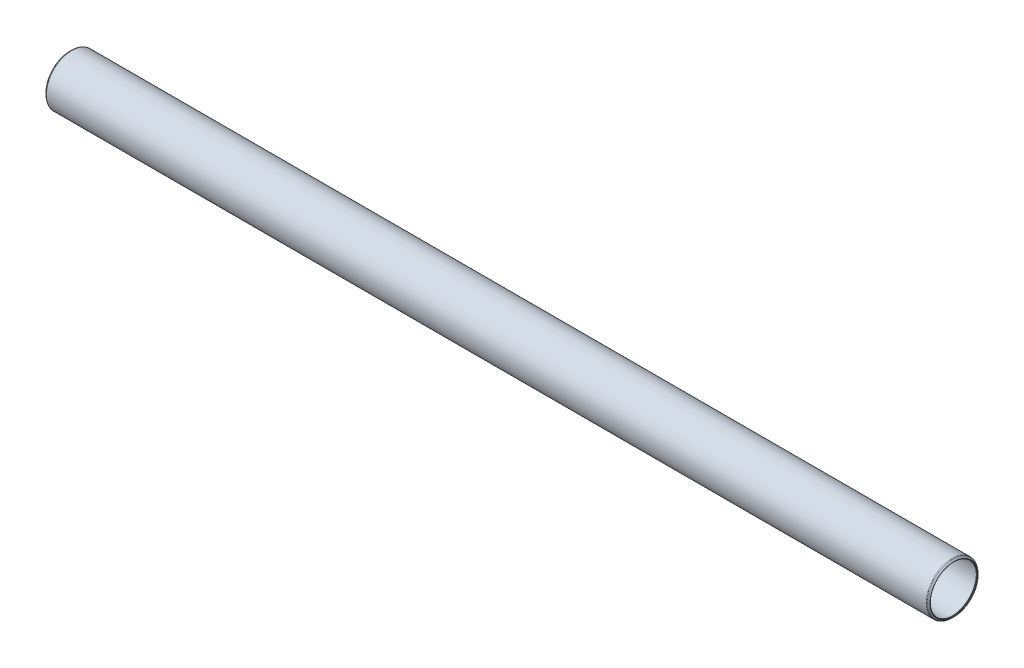
ISO-10303-21;
HEADER;
FILE_DESCRIPTION(('STEP AP214'),'2;1');
FILE_NAME('part.step','',(''),(''),'','','');
FILE_SCHEMA(('AUTOMOTIVE_DESIGN { 1 0 10303 214 1 1 1 1 }'));
ENDSEC;
DATA;
#1=APPLICATION_CONTEXT('core data for automotive mechanical design processes');
#2=APPLICATION_PROTOCOL_DEFINITION('international standard','automotive_design',2000,#1);
#3=PRODUCT_CONTEXT('',#1,'mechanical');
#4=PRODUCT('Part','Part','',(#3));
#5=PRODUCT_RELATED_PRODUCT_CATEGORY('part','',(#4));
#6=PRODUCT_DEFINITION_FORMATION('','',#4);
#7=PRODUCT_DEFINITION_CONTEXT('part definition',#1,'design');
#8=PRODUCT_DEFINITION('design','',#6,#7);
#9=PRODUCT_DEFINITION_SHAPE('','',#8);
#10=(LENGTH_UNIT() NAMED_UNIT(*) SI_UNIT(.MILLI.,.METRE.));
#11=(NAMED_UNIT(*) PLANE_ANGLE_UNIT() SI_UNIT($,.RADIAN.));
#12=(NAMED_UNIT(*) SI_UNIT($,.STERADIAN.) SOLID_ANGLE_UNIT());
#13=UNCERTAINTY_MEASURE_WITH_UNIT(LENGTH_MEASURE(1.E-05),#10,'distance_accuracy_value','');
#14=(GEOMETRIC_REPRESENTATION_CONTEXT(3) GLOBAL_UNCERTAINTY_ASSIGNED_CONTEXT((#13)) GLOBAL_UNIT_ASSIGNED_CONTEXT((#10,
#11,#12)) REPRESENTATION_CONTEXT('',''));
#15=CARTESIAN_POINT('',(0.,0.,0.));
#16=DIRECTION('',(0.,0.,1.));
#17=DIRECTION('',(1.,0.,0.));
#18=AXIS2_PLACEMENT_3D('',#15,#16,#17);
#19=CARTESIAN_POINT('',(403.01545,0.,0.));
#20=DIRECTION('',(-1.,0.,0.));
#21=DIRECTION('',(0.,0.,1.));
#22=AXIS2_PLACEMENT_3D('',#19,#20,#21);
#23=CYLINDRICAL_SURFACE('',#22,22.39645);
#24=CARTESIAN_POINT('',(-401.96135,0.,0.));
#25=DIRECTION('',(1.,0.,0.));
#26=DIRECTION('',(0.,0.,-1.));
#27=AXIS2_PLACEMENT_3D('',#24,#25,#26);
#28=CIRCLE('',#27,22.39645);
#29=CARTESIAN_POINT('',(-401.96135,0.,-22.39645));
#30=VERTEX_POINT('',#29);
#31=EDGE_CURVE('E88',#30,#30,#28,.F.);
#32=ORIENTED_EDGE('',*,*,#31,.T.);
#33=EDGE_LOOP('',(#32));
#34=FACE_BOUND('',#33,.T.);
#35=CARTESIAN_POINT('',(401.96135,0.,0.));
#36=DIRECTION('',(-1.,0.,0.));
#37=DIRECTION('',(0.,0.,1.));
#38=AXIS2_PLACEMENT_3D('',#35,#36,#37);
#39=CIRCLE('',#38,22.39645);
#40=CARTESIAN_POINT('',(401.96135,0.,22.39645));
#41=VERTEX_POINT('',#40);
#42=EDGE_CURVE('E17',#41,#41,#39,.F.);
#43=ORIENTED_EDGE('',*,*,#42,.T.);
#44=EDGE_LOOP('',(#43));
#45=FACE_BOUND('',#44,.T.);
#46=ADVANCED_FACE('F14',(#34,#45),#23,.F.);
#47=CARTESIAN_POINT('',(401.96135,0.,0.));
#48=DIRECTION('',(-1.,0.,0.));
#49=DIRECTION('',(0.,-1.,0.));
#50=AXIS2_PLACEMENT_3D('',#47,#48,#49);
#51=CONICAL_SURFACE('',#50,22.39645,0.785398163397473);
#52=CARTESIAN_POINT('',(403.01545,0.,0.));
#53=DIRECTION('',(-1.,0.,0.));
#54=DIRECTION('',(0.,0.,1.));
#55=AXIS2_PLACEMENT_3D('',#52,#53,#54);
#56=CIRCLE('',#55,21.34235);
#57=CARTESIAN_POINT('',(403.01545,0.,21.34235));
#58=VERTEX_POINT('',#57);
#59=EDGE_CURVE('E86',#58,#58,#56,.F.);
#60=ORIENTED_EDGE('',*,*,#59,.T.);
#61=EDGE_LOOP('',(#60));
#62=FACE_BOUND('',#61,.T.);
#63=ORIENTED_EDGE('',*,*,#42,.F.);
#64=EDGE_LOOP('',(#63));
#65=FACE_BOUND('',#64,.T.);
#66=ADVANCED_FACE('F96',(#62,#65),#51,.F.);
#67=CARTESIAN_POINT('',(-401.96135,0.,0.));
#68=DIRECTION('',(1.,0.,0.));
#69=DIRECTION('',(0.,1.,0.));
#70=AXIS2_PLACEMENT_3D('',#67,#68,#69);
#71=CONICAL_SURFACE('',#70,22.39645,0.785398163397473);
#72=CARTESIAN_POINT('',(-403.01545,0.,0.));
#73=DIRECTION('',(-1.,0.,0.));
#74=DIRECTION('',(0.,0.,1.));
#75=AXIS2_PLACEMENT_3D('',#72,#73,#74);
#76=CIRCLE('',#75,21.34235);
#77=CARTESIAN_POINT('',(-403.01545,0.,21.34235));
#78=VERTEX_POINT('',#77);
#79=EDGE_CURVE('E83',#78,#78,#76,.T.);
#80=ORIENTED_EDGE('',*,*,#79,.T.);
#81=EDGE_LOOP('',(#80));
#82=FACE_BOUND('',#81,.T.);
#83=ORIENTED_EDGE('',*,*,#31,.F.);
#84=EDGE_LOOP('',(#83));
#85=FACE_BOUND('',#84,.T.);
#86=ADVANCED_FACE('F98',(#82,#85),#71,.F.);
#87=CARTESIAN_POINT('',(403.01545,0.,0.));
#88=DIRECTION('',(-1.,0.,0.));
#89=DIRECTION('',(0.,0.,1.));
#90=AXIS2_PLACEMENT_3D('',#87,#88,#89);
#91=CYLINDRICAL_SURFACE('',#90,21.34235);
#92=ORIENTED_EDGE('',*,*,#59,.F.);
#93=EDGE_LOOP('',(#92));
#94=FACE_BOUND('',#93,.T.);
#95=CARTESIAN_POINT('',(403.5425,0.,0.));
#96=DIRECTION('',(1.,0.,0.));
#97=DIRECTION('',(0.,0.,-1.));
#98=AXIS2_PLACEMENT_3D('',#95,#96,#97);
#99=CIRCLE('',#98,21.34235);
#100=CARTESIAN_POINT('',(403.5425,0.,-21.34235));
#101=VERTEX_POINT('',#100);
#102=EDGE_CURVE('E80',#101,#101,#99,.T.);
#103=ORIENTED_EDGE('',*,*,#102,.T.);
#104=EDGE_LOOP('',(#103));
#105=FACE_BOUND('',#104,.T.);
#106=ADVANCED_FACE('F105',(#94,#105),#91,.F.);
#107=CARTESIAN_POINT('',(403.01545,0.,0.));
#108=DIRECTION('',(-1.,0.,0.));
#109=DIRECTION('',(0.,0.,1.));
#110=AXIS2_PLACEMENT_3D('',#107,#108,#109);
#111=CYLINDRICAL_SURFACE('',#110,21.34235);
#112=CARTESIAN_POINT('',(-403.5425,0.,0.));
#113=DIRECTION('',(-1.,0.,0.));
#114=DIRECTION('',(0.,0.,1.));
#115=AXIS2_PLACEMENT_3D('',#112,#113,#114);
#116=CIRCLE('',#115,21.34235);
#117=CARTESIAN_POINT('',(-403.5425,0.,21.34235));
#118=VERTEX_POINT('',#117);
#119=EDGE_CURVE('E77',#118,#118,#116,.T.);
#120=ORIENTED_EDGE('',*,*,#119,.T.);
#121=EDGE_LOOP('',(#120));
#122=FACE_BOUND('',#121,.T.);
#123=ORIENTED_EDGE('',*,*,#79,.F.);
#124=EDGE_LOOP('',(#123));
#125=FACE_BOUND('',#124,.T.);
#126=ADVANCED_FACE('F157',(#122,#125),#111,.F.);
#127=CARTESIAN_POINT('',(403.934533696838,0.,0.));
#128=DIRECTION('',(1.,0.,0.));
#129=DIRECTION('',(0.,1.,0.));
#130=AXIS2_PLACEMENT_3D('',#127,#128,#129);
#131=CONICAL_SURFACE('',#130,21.7343836968381,0.785398163397457);
#132=ORIENTED_EDGE('',*,*,#102,.F.);
#133=EDGE_LOOP('',(#132));
#134=FACE_BOUND('',#133,.T.);
#135=CARTESIAN_POINT('',(403.934533696838,0.,0.));
#136=DIRECTION('',(1.,0.,0.));
#137=DIRECTION('',(0.,0.,-1.));
#138=AXIS2_PLACEMENT_3D('',#135,#136,#137);
#139=CIRCLE('',#138,21.7343836968381);
#140=CARTESIAN_POINT('',(403.934533696838,0.,-21.7343836968381));
#141=VERTEX_POINT('',#140);
#142=EDGE_CURVE('E74',#141,#141,#139,.F.);
#143=ORIENTED_EDGE('',*,*,#142,.F.);
#144=EDGE_LOOP('',(#143));
#145=FACE_BOUND('',#144,.T.);
#146=ADVANCED_FACE('F150',(#134,#145),#131,.F.);
#147=CARTESIAN_POINT('',(-403.934533696838,0.,0.));
#148=DIRECTION('',(-1.,0.,0.));
#149=DIRECTION('',(0.,-1.,0.));
#150=AXIS2_PLACEMENT_3D('',#147,#148,#149);
#151=CONICAL_SURFACE('',#150,21.734383696838,0.785398163397453);
#152=ORIENTED_EDGE('',*,*,#119,.F.);
#153=EDGE_LOOP('',(#152));
#154=FACE_BOUND('',#153,.T.);
#155=CARTESIAN_POINT('',(-403.934533696838,0.,0.));
#156=DIRECTION('',(1.,0.,0.));
#157=DIRECTION('',(0.,0.,-1.));
#158=AXIS2_PLACEMENT_3D('',#155,#156,#157);
#159=CIRCLE('',#158,21.734383696838);
#160=CARTESIAN_POINT('',(-403.934533696838,0.,-21.734383696838));
#161=VERTEX_POINT('',#160);
#162=EDGE_CURVE('E56',#161,#161,#159,.T.);
#163=ORIENTED_EDGE('',*,*,#162,.F.);
#164=EDGE_LOOP('',(#163));
#165=FACE_BOUND('',#164,.T.);
#166=ADVANCED_FACE('F69',(#154,#165),#151,.F.);
#167=CARTESIAN_POINT('',(403.844731135627,0.,0.));
#168=DIRECTION('',(1.,0.,0.));
#169=DIRECTION('',(0.,0.,-1.));
#170=AXIS2_PLACEMENT_3D('',#167,#168,#169);
#171=TOROIDAL_SURFACE('',#170,21.8241862580487,0.127000000000092);
#172=ORIENTED_EDGE('',*,*,#142,.T.);
#173=EDGE_LOOP('',(#172));
#174=FACE_BOUND('',#173,.T.);
#175=CARTESIAN_POINT('',(403.934533696838,0.,0.));
#176=DIRECTION('',(-1.,0.,0.));
#177=DIRECTION('',(0.,0.,1.));
#178=AXIS2_PLACEMENT_3D('',#175,#176,#177);
#179=CIRCLE('',#178,21.9139888192594);
#180=CARTESIAN_POINT('',(403.934533696838,0.,21.9139888192594));
#181=VERTEX_POINT('',#180);
#182=EDGE_CURVE('E53',#181,#181,#179,.T.);
#183=ORIENTED_EDGE('',*,*,#182,.F.);
#184=EDGE_LOOP('',(#183));
#185=FACE_BOUND('',#184,.T.);
#186=ADVANCED_FACE('F65',(#174,#185),#171,.T.);
#187=CARTESIAN_POINT('',(-403.844731135627,0.,0.));
#188=DIRECTION('',(1.,0.,0.));
#189=DIRECTION('',(0.,0.,-1.));
#190=AXIS2_PLACEMENT_3D('',#187,#188,#189);
#191=TOROIDAL_SURFACE('',#190,21.8241862580487,0.127000000000003);
#192=CARTESIAN_POINT('',(-403.934533696838,0.,0.));
#193=DIRECTION('',(1.,0.,0.));
#194=DIRECTION('',(0.,0.,-1.));
#195=AXIS2_PLACEMENT_3D('',#192,#193,#194);
#196=CIRCLE('',#195,21.9139888192594);
#197=CARTESIAN_POINT('',(-403.934533696838,0.,-21.9139888192594));
#198=VERTEX_POINT('',#197);
#199=EDGE_CURVE('E50',#198,#198,#196,.T.);
#200=ORIENTED_EDGE('',*,*,#199,.F.);
#201=EDGE_LOOP('',(#200));
#202=FACE_BOUND('',#201,.T.);
#203=ORIENTED_EDGE('',*,*,#162,.T.);
#204=EDGE_LOOP('',(#203));
#205=FACE_BOUND('',#204,.T.);
#206=ADVANCED_FACE('F61',(#202,#205),#191,.T.);
#207=CARTESIAN_POINT('',(402.732111258049,0.,0.));
#208=DIRECTION('',(-1.,0.,0.));
#209=DIRECTION('',(0.,-1.,0.));
#210=AXIS2_PLACEMENT_3D('',#207,#208,#209);
#211=CONICAL_SURFACE('',#210,23.1164112580488,0.785398163397454);
#212=CARTESIAN_POINT('',(402.732111258049,0.,0.));
#213=DIRECTION('',(1.,0.,0.));
#214=DIRECTION('',(0.,0.,-1.));
#215=AXIS2_PLACEMENT_3D('',#212,#213,#214);
#216=CIRCLE('',#215,23.1164112580488);
#217=CARTESIAN_POINT('',(402.732111258049,0.,-23.1164112580488));
#218=VERTEX_POINT('',#217);
#219=EDGE_CURVE('E47',#218,#218,#216,.F.);
#220=ORIENTED_EDGE('',*,*,#219,.F.);
#221=EDGE_LOOP('',(#220));
#222=FACE_BOUND('',#221,.T.);
#223=ORIENTED_EDGE('',*,*,#182,.T.);
#224=EDGE_LOOP('',(#223));
#225=FACE_BOUND('',#224,.T.);
#226=ADVANCED_FACE('F64',(#222,#225),#211,.T.);
#227=CARTESIAN_POINT('',(-402.732111258049,0.,0.));
#228=DIRECTION('',(1.,0.,0.));
#229=DIRECTION('',(0.,1.,0.));
#230=AXIS2_PLACEMENT_3D('',#227,#228,#229);
#231=CONICAL_SURFACE('',#230,23.1164112580487,0.785398163397444);
#232=CARTESIAN_POINT('',(-402.732111258049,0.,0.));
#233=DIRECTION('',(1.,0.,0.));
#234=DIRECTION('',(0.,0.,-1.));
#235=AXIS2_PLACEMENT_3D('',#232,#233,#234);
#236=CIRCLE('',#235,23.1164112580488);
#237=CARTESIAN_POINT('',(-402.732111258049,0.,-23.1164112580488));
#238=VERTEX_POINT('',#237);
#239=EDGE_CURVE('E26',#238,#238,#236,.T.);
#240=ORIENTED_EDGE('',*,*,#239,.F.);
#241=EDGE_LOOP('',(#240));
#242=FACE_BOUND('',#241,.T.);
#243=ORIENTED_EDGE('',*,*,#199,.T.);
#244=EDGE_LOOP('',(#243));
#245=FACE_BOUND('',#244,.T.);
#246=ADVANCED_FACE('F42',(#242,#245),#231,.T.);
#247=CARTESIAN_POINT('',(401.98675,0.,0.));
#248=DIRECTION('',(1.,0.,0.));
#249=DIRECTION('',(0.,0.,-1.));
#250=AXIS2_PLACEMENT_3D('',#247,#248,#249);
#251=TOROIDAL_SURFACE('',#250,22.3710499999998,1.05410000000013);
#252=ORIENTED_EDGE('',*,*,#219,.T.);
#253=EDGE_LOOP('',(#252));
#254=FACE_BOUND('',#253,.T.);
#255=CARTESIAN_POINT('',(401.98675,0.,0.));
#256=DIRECTION('',(-1.,0.,0.));
#257=DIRECTION('',(0.,0.,1.));
#258=AXIS2_PLACEMENT_3D('',#255,#256,#257);
#259=CIRCLE('',#258,23.42515);
#260=CARTESIAN_POINT('',(401.98675,0.,23.42515));
#261=VERTEX_POINT('',#260);
#262=EDGE_CURVE('E21',#261,#261,#259,.T.);
#263=ORIENTED_EDGE('',*,*,#262,.F.);
#264=EDGE_LOOP('',(#263));
#265=FACE_BOUND('',#264,.T.);
#266=ADVANCED_FACE('F38',(#254,#265),#251,.T.);
#267=CARTESIAN_POINT('',(-401.98675,0.,0.));
#268=DIRECTION('',(1.,0.,0.));
#269=DIRECTION('',(0.,0.,-1.));
#270=AXIS2_PLACEMENT_3D('',#267,#268,#269);
#271=TOROIDAL_SURFACE('',#270,22.37105,1.05409999999998);
#272=CARTESIAN_POINT('',(-401.98675,0.,0.));
#273=DIRECTION('',(-1.,0.,0.));
#274=DIRECTION('',(0.,0.,1.));
#275=AXIS2_PLACEMENT_3D('',#272,#273,#274);
#276=CIRCLE('',#275,23.42515);
#277=CARTESIAN_POINT('',(-401.98675,0.,23.42515));
#278=VERTEX_POINT('',#277);
#279=EDGE_CURVE('E9',#278,#278,#276,.F.);
#280=ORIENTED_EDGE('',*,*,#279,.F.);
#281=EDGE_LOOP('',(#280));
#282=FACE_BOUND('',#281,.T.);
#283=ORIENTED_EDGE('',*,*,#239,.T.);
#284=EDGE_LOOP('',(#283));
#285=FACE_BOUND('',#284,.T.);
#286=ADVANCED_FACE('F33',(#282,#285),#271,.T.);
#287=CARTESIAN_POINT('',(403.01545,0.,0.));
#288=DIRECTION('',(-1.,0.,0.));
#289=DIRECTION('',(0.,0.,1.));
#290=AXIS2_PLACEMENT_3D('',#287,#288,#289);
#291=CYLINDRICAL_SURFACE('',#290,23.42515);
#292=ORIENTED_EDGE('',*,*,#262,.T.);
#293=EDGE_LOOP('',(#292));
#294=FACE_BOUND('',#293,.T.);
#295=ORIENTED_EDGE('',*,*,#279,.T.);
#296=EDGE_LOOP('',(#295));
#297=FACE_BOUND('',#296,.T.);
#298=ADVANCED_FACE('F37',(#294,#297),#291,.T.);
#299=CLOSED_SHELL('',(#46,#66,#86,#106,#126,#146,#166,#186,#206,#226,#246,#266,#286,#298));
#300=MANIFOLD_SOLID_BREP('B1',#299);
#301=ADVANCED_BREP_SHAPE_REPRESENTATION('',(#18,#300),#14);
#302=SHAPE_DEFINITION_REPRESENTATION(#9,#301);
ENDSEC;
END-ISO-10303-21;
